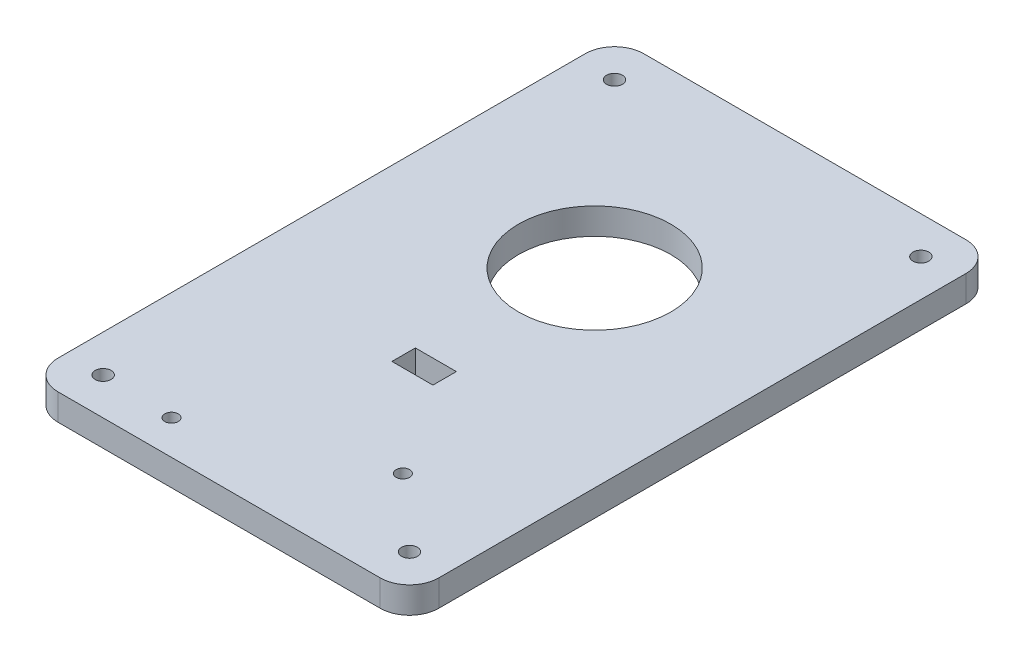
ISO-10303-21;
HEADER;
FILE_DESCRIPTION(('STEP AP214'),'2;1');
FILE_NAME('part.step','',(''),(''),'','','');
FILE_SCHEMA(('AUTOMOTIVE_DESIGN { 1 0 10303 214 1 1 1 1 }'));
ENDSEC;
DATA;
#1=APPLICATION_CONTEXT('core data for automotive mechanical design processes');
#2=APPLICATION_PROTOCOL_DEFINITION('international standard','automotive_design',2000,#1);
#3=PRODUCT_CONTEXT('',#1,'mechanical');
#4=PRODUCT('Part','Part','',(#3));
#5=PRODUCT_RELATED_PRODUCT_CATEGORY('part','',(#4));
#6=PRODUCT_DEFINITION_FORMATION('','',#4);
#7=PRODUCT_DEFINITION_CONTEXT('part definition',#1,'design');
#8=PRODUCT_DEFINITION('design','',#6,#7);
#9=PRODUCT_DEFINITION_SHAPE('','',#8);
#10=(LENGTH_UNIT() NAMED_UNIT(*) SI_UNIT(.MILLI.,.METRE.));
#11=(NAMED_UNIT(*) PLANE_ANGLE_UNIT() SI_UNIT($,.RADIAN.));
#12=(NAMED_UNIT(*) SI_UNIT($,.STERADIAN.) SOLID_ANGLE_UNIT());
#13=UNCERTAINTY_MEASURE_WITH_UNIT(LENGTH_MEASURE(1.E-05),#10,'distance_accuracy_value','');
#14=(GEOMETRIC_REPRESENTATION_CONTEXT(3) GLOBAL_UNCERTAINTY_ASSIGNED_CONTEXT((#13)) GLOBAL_UNIT_ASSIGNED_CONTEXT((#10,
#11,#12)) REPRESENTATION_CONTEXT('',''));
#15=CARTESIAN_POINT('',(0.,0.,0.));
#16=DIRECTION('',(0.,0.,1.));
#17=DIRECTION('',(1.,0.,0.));
#18=AXIS2_PLACEMENT_3D('',#15,#16,#17);
#19=CARTESIAN_POINT('',(32.5,4.5,-50.));
#20=DIRECTION('',(-1.,0.,0.));
#21=DIRECTION('',(0.,0.,1.));
#22=AXIS2_PLACEMENT_3D('',#19,#20,#21);
#23=PLANE('',#22);
#24=DIRECTION('',(0.,0.,-1.));
#25=VECTOR('',#24,1.);
#26=CARTESIAN_POINT('',(32.5,0.,-50.));
#27=LINE('',#26,#25);
#28=CARTESIAN_POINT('',(32.5,0.,45.));
#29=VERTEX_POINT('',#28);
#30=CARTESIAN_POINT('',(32.5,0.,-45.));
#31=VERTEX_POINT('',#30);
#32=EDGE_CURVE('E192',#29,#31,#27,.T.);
#33=ORIENTED_EDGE('',*,*,#32,.T.);
#34=DIRECTION('',(0.,-1.,0.));
#35=VECTOR('',#34,1.);
#36=CARTESIAN_POINT('',(32.5,4.5,-45.));
#37=LINE('',#36,#35);
#38=CARTESIAN_POINT('',(32.5,4.5,-45.));
#39=VERTEX_POINT('',#38);
#40=EDGE_CURVE('E245',#31,#39,#37,.F.);
#41=ORIENTED_EDGE('',*,*,#40,.T.);
#42=DIRECTION('',(0.,0.,-1.));
#43=VECTOR('',#42,1.);
#44=CARTESIAN_POINT('',(32.5,4.5,-50.));
#45=LINE('',#44,#43);
#46=CARTESIAN_POINT('',(32.5,4.5,45.));
#47=VERTEX_POINT('',#46);
#48=EDGE_CURVE('E193',#47,#39,#45,.T.);
#49=ORIENTED_EDGE('',*,*,#48,.F.);
#50=DIRECTION('',(0.,-1.,0.));
#51=VECTOR('',#50,1.);
#52=CARTESIAN_POINT('',(32.5,4.5,45.));
#53=LINE('',#52,#51);
#54=EDGE_CURVE('E242',#47,#29,#53,.T.);
#55=ORIENTED_EDGE('',*,*,#54,.T.);
#56=EDGE_LOOP('',(#33,#41,#49,#55));
#57=FACE_BOUND('',#56,.T.);
#58=ADVANCED_FACE('F38',(#57),#23,.F.);
#59=CARTESIAN_POINT('',(-32.5,4.5,-50.));
#60=DIRECTION('',(0.,0.,1.));
#61=DIRECTION('',(1.,0.,0.));
#62=AXIS2_PLACEMENT_3D('',#59,#60,#61);
#63=PLANE('',#62);
#64=DIRECTION('',(-1.,0.,0.));
#65=VECTOR('',#64,1.);
#66=CARTESIAN_POINT('',(-32.5,0.,-50.));
#67=LINE('',#66,#65);
#68=CARTESIAN_POINT('',(27.5,0.,-50.));
#69=VERTEX_POINT('',#68);
#70=CARTESIAN_POINT('',(-27.5,0.,-50.));
#71=VERTEX_POINT('',#70);
#72=EDGE_CURVE('E209',#69,#71,#67,.T.);
#73=ORIENTED_EDGE('',*,*,#72,.T.);
#74=DIRECTION('',(0.,-1.,0.));
#75=VECTOR('',#74,1.);
#76=CARTESIAN_POINT('',(-27.5,4.5,-50.));
#77=LINE('',#76,#75);
#78=CARTESIAN_POINT('',(-27.5,4.5,-50.));
#79=VERTEX_POINT('',#78);
#80=EDGE_CURVE('E232',#71,#79,#77,.F.);
#81=ORIENTED_EDGE('',*,*,#80,.T.);
#82=DIRECTION('',(-1.,0.,0.));
#83=VECTOR('',#82,1.);
#84=CARTESIAN_POINT('',(-32.5,4.5,-50.));
#85=LINE('',#84,#83);
#86=CARTESIAN_POINT('',(27.5,4.5,-50.));
#87=VERTEX_POINT('',#86);
#88=EDGE_CURVE('E196',#87,#79,#85,.T.);
#89=ORIENTED_EDGE('',*,*,#88,.F.);
#90=DIRECTION('',(0.,-1.,0.));
#91=VECTOR('',#90,1.);
#92=CARTESIAN_POINT('',(27.5,4.5,-50.));
#93=LINE('',#92,#91);
#94=EDGE_CURVE('E229',#87,#69,#93,.T.);
#95=ORIENTED_EDGE('',*,*,#94,.T.);
#96=EDGE_LOOP('',(#73,#81,#89,#95));
#97=FACE_BOUND('',#96,.T.);
#98=ADVANCED_FACE('F276',(#97),#63,.F.);
#99=CARTESIAN_POINT('',(-32.5,4.5,-50.));
#100=DIRECTION('',(1.,0.,0.));
#101=DIRECTION('',(0.,0.,-1.));
#102=AXIS2_PLACEMENT_3D('',#99,#100,#101);
#103=PLANE('',#102);
#104=DIRECTION('',(0.,0.,1.));
#105=VECTOR('',#104,1.);
#106=CARTESIAN_POINT('',(-32.5,4.5,-50.));
#107=LINE('',#106,#105);
#108=CARTESIAN_POINT('',(-32.5,4.5,-45.));
#109=VERTEX_POINT('',#108);
#110=CARTESIAN_POINT('',(-32.5,4.5,45.));
#111=VERTEX_POINT('',#110);
#112=EDGE_CURVE('E200',#109,#111,#107,.T.);
#113=ORIENTED_EDGE('',*,*,#112,.F.);
#114=DIRECTION('',(0.,-1.,0.));
#115=VECTOR('',#114,1.);
#116=CARTESIAN_POINT('',(-32.5,4.5,-45.));
#117=LINE('',#116,#115);
#118=CARTESIAN_POINT('',(-32.5,0.,-45.));
#119=VERTEX_POINT('',#118);
#120=EDGE_CURVE('E218',#109,#119,#117,.T.);
#121=ORIENTED_EDGE('',*,*,#120,.T.);
#122=DIRECTION('',(0.,0.,1.));
#123=VECTOR('',#122,1.);
#124=CARTESIAN_POINT('',(-32.5,0.,-50.));
#125=LINE('',#124,#123);
#126=CARTESIAN_POINT('',(-32.5,0.,45.));
#127=VERTEX_POINT('',#126);
#128=EDGE_CURVE('E212',#119,#127,#125,.T.);
#129=ORIENTED_EDGE('',*,*,#128,.T.);
#130=DIRECTION('',(0.,-1.,0.));
#131=VECTOR('',#130,1.);
#132=CARTESIAN_POINT('',(-32.5,4.5,45.));
#133=LINE('',#132,#131);
#134=EDGE_CURVE('E206',#127,#111,#133,.F.);
#135=ORIENTED_EDGE('',*,*,#134,.T.);
#136=EDGE_LOOP('',(#113,#121,#129,#135));
#137=FACE_BOUND('',#136,.T.);
#138=ADVANCED_FACE('F282',(#137),#103,.F.);
#139=CARTESIAN_POINT('',(-32.5,4.5,50.));
#140=DIRECTION('',(0.,0.,-1.));
#141=DIRECTION('',(-1.,0.,0.));
#142=AXIS2_PLACEMENT_3D('',#139,#140,#141);
#143=PLANE('',#142);
#144=DIRECTION('',(1.,0.,0.));
#145=VECTOR('',#144,1.);
#146=CARTESIAN_POINT('',(-32.5,0.,50.));
#147=LINE('',#146,#145);
#148=CARTESIAN_POINT('',(-27.5,0.,50.));
#149=VERTEX_POINT('',#148);
#150=CARTESIAN_POINT('',(27.5,0.,50.));
#151=VERTEX_POINT('',#150);
#152=EDGE_CURVE('E197',#149,#151,#147,.T.);
#153=ORIENTED_EDGE('',*,*,#152,.T.);
#154=DIRECTION('',(0.,-1.,0.));
#155=VECTOR('',#154,1.);
#156=CARTESIAN_POINT('',(27.5,4.5,50.));
#157=LINE('',#156,#155);
#158=CARTESIAN_POINT('',(27.5,4.5,50.));
#159=VERTEX_POINT('',#158);
#160=EDGE_CURVE('E250',#151,#159,#157,.F.);
#161=ORIENTED_EDGE('',*,*,#160,.T.);
#162=DIRECTION('',(1.,0.,0.));
#163=VECTOR('',#162,1.);
#164=CARTESIAN_POINT('',(-32.5,4.5,50.));
#165=LINE('',#164,#163);
#166=CARTESIAN_POINT('',(-27.5,4.5,50.));
#167=VERTEX_POINT('',#166);
#168=EDGE_CURVE('E203',#167,#159,#165,.T.);
#169=ORIENTED_EDGE('',*,*,#168,.F.);
#170=DIRECTION('',(0.,-1.,0.));
#171=VECTOR('',#170,1.);
#172=CARTESIAN_POINT('',(-27.5,4.5,50.));
#173=LINE('',#172,#171);
#174=EDGE_CURVE('E247',#167,#149,#173,.T.);
#175=ORIENTED_EDGE('',*,*,#174,.T.);
#176=EDGE_LOOP('',(#153,#161,#169,#175));
#177=FACE_BOUND('',#176,.T.);
#178=ADVANCED_FACE('F324',(#177),#143,.F.);
#179=CARTESIAN_POINT('',(0.,4.5,0.));
#180=DIRECTION('',(0.,1.,0.));
#181=DIRECTION('',(0.,0.,1.));
#182=AXIS2_PLACEMENT_3D('',#179,#180,#181);
#183=PLANE('',#182);
#184=CARTESIAN_POINT('',(0.,4.5,-14.1153706470118));
#185=DIRECTION('',(0.,1.,0.));
#186=DIRECTION('',(0.,0.,1.));
#187=AXIS2_PLACEMENT_3D('',#184,#185,#186);
#188=CIRCLE('',#187,13.);
#189=CARTESIAN_POINT('',(0.,4.5,-1.11537064701181));
#190=VERTEX_POINT('',#189);
#191=EDGE_CURVE('E518',#190,#190,#188,.T.);
#192=ORIENTED_EDGE('',*,*,#191,.F.);
#193=EDGE_LOOP('',(#192));
#194=FACE_BOUND('',#193,.T.);
#195=DIRECTION('',(0.,0.,-1.));
#196=VECTOR('',#195,1.);
#197=CARTESIAN_POINT('',(3.5,4.5,13.));
#198=LINE('',#197,#196);
#199=CARTESIAN_POINT('',(3.5,4.5,17.));
#200=VERTEX_POINT('',#199);
#201=CARTESIAN_POINT('',(3.5,4.5,13.));
#202=VERTEX_POINT('',#201);
#203=EDGE_CURVE('E54',#200,#202,#198,.T.);
#204=ORIENTED_EDGE('',*,*,#203,.F.);
#205=DIRECTION('',(1.,0.,0.));
#206=VECTOR('',#205,1.);
#207=CARTESIAN_POINT('',(-3.5,4.5,17.));
#208=LINE('',#207,#206);
#209=CARTESIAN_POINT('',(-3.5,4.5,17.));
#210=VERTEX_POINT('',#209);
#211=EDGE_CURVE('E147',#210,#200,#208,.T.);
#212=ORIENTED_EDGE('',*,*,#211,.F.);
#213=DIRECTION('',(0.,0.,1.));
#214=VECTOR('',#213,1.);
#215=CARTESIAN_POINT('',(-3.5,4.5,13.));
#216=LINE('',#215,#214);
#217=CARTESIAN_POINT('',(-3.5,4.5,13.));
#218=VERTEX_POINT('',#217);
#219=EDGE_CURVE('E131',#218,#210,#216,.T.);
#220=ORIENTED_EDGE('',*,*,#219,.F.);
#221=DIRECTION('',(-1.,0.,0.));
#222=VECTOR('',#221,1.);
#223=CARTESIAN_POINT('',(-3.5,4.5,13.));
#224=LINE('',#223,#222);
#225=EDGE_CURVE('E140',#202,#218,#224,.T.);
#226=ORIENTED_EDGE('',*,*,#225,.F.);
#227=EDGE_LOOP('',(#204,#212,#220,#226));
#228=FACE_BOUND('',#227,.T.);
#229=CARTESIAN_POINT('',(14.,4.5,32.6313813250558));
#230=DIRECTION('',(0.,1.,0.));
#231=DIRECTION('',(0.,0.,1.));
#232=AXIS2_PLACEMENT_3D('',#229,#230,#231);
#233=CIRCLE('',#232,1.15);
#234=CARTESIAN_POINT('',(14.,4.5,33.7813813250558));
#235=VERTEX_POINT('',#234);
#236=EDGE_CURVE('E154',#235,#235,#233,.T.);
#237=ORIENTED_EDGE('',*,*,#236,.F.);
#238=EDGE_LOOP('',(#237));
#239=FACE_BOUND('',#238,.T.);
#240=CARTESIAN_POINT('',(-14.,4.5,44.1313813250558));
#241=DIRECTION('',(0.,1.,0.));
#242=DIRECTION('',(0.,0.,1.));
#243=AXIS2_PLACEMENT_3D('',#240,#241,#242);
#244=CIRCLE('',#243,1.15);
#245=CARTESIAN_POINT('',(-14.,4.5,45.2813813250558));
#246=VERTEX_POINT('',#245);
#247=EDGE_CURVE('E162',#246,#246,#244,.T.);
#248=ORIENTED_EDGE('',*,*,#247,.F.);
#249=EDGE_LOOP('',(#248));
#250=FACE_BOUND('',#249,.T.);
#251=CARTESIAN_POINT('',(-26.15,4.5,-43.65));
#252=DIRECTION('',(0.,1.,0.));
#253=DIRECTION('',(0.,0.,1.));
#254=AXIS2_PLACEMENT_3D('',#251,#252,#253);
#255=CIRCLE('',#254,1.35255);
#256=CARTESIAN_POINT('',(-26.15,4.5,-42.29745));
#257=VERTEX_POINT('',#256);
#258=EDGE_CURVE('E168',#257,#257,#255,.T.);
#259=ORIENTED_EDGE('',*,*,#258,.F.);
#260=EDGE_LOOP('',(#259));
#261=FACE_BOUND('',#260,.T.);
#262=CARTESIAN_POINT('',(26.15,4.5,-43.65));
#263=DIRECTION('',(0.,1.,0.));
#264=DIRECTION('',(0.,0.,1.));
#265=AXIS2_PLACEMENT_3D('',#262,#263,#264);
#266=CIRCLE('',#265,1.35255);
#267=CARTESIAN_POINT('',(26.15,4.5,-42.29745));
#268=VERTEX_POINT('',#267);
#269=EDGE_CURVE('E174',#268,#268,#266,.T.);
#270=ORIENTED_EDGE('',*,*,#269,.F.);
#271=EDGE_LOOP('',(#270));
#272=FACE_BOUND('',#271,.T.);
#273=CARTESIAN_POINT('',(26.15,4.5,43.65));
#274=DIRECTION('',(0.,1.,0.));
#275=DIRECTION('',(0.,0.,1.));
#276=AXIS2_PLACEMENT_3D('',#273,#274,#275);
#277=CIRCLE('',#276,1.35255);
#278=CARTESIAN_POINT('',(26.15,4.5,45.00255));
#279=VERTEX_POINT('',#278);
#280=EDGE_CURVE('E180',#279,#279,#277,.T.);
#281=ORIENTED_EDGE('',*,*,#280,.F.);
#282=EDGE_LOOP('',(#281));
#283=FACE_BOUND('',#282,.T.);
#284=CARTESIAN_POINT('',(-26.15,4.5,43.65));
#285=DIRECTION('',(0.,1.,0.));
#286=DIRECTION('',(0.,0.,1.));
#287=AXIS2_PLACEMENT_3D('',#284,#285,#286);
#288=CIRCLE('',#287,1.35255);
#289=CARTESIAN_POINT('',(-26.15,4.5,45.00255));
#290=VERTEX_POINT('',#289);
#291=EDGE_CURVE('E186',#290,#290,#288,.T.);
#292=ORIENTED_EDGE('',*,*,#291,.F.);
#293=EDGE_LOOP('',(#292));
#294=FACE_BOUND('',#293,.T.);
#295=ORIENTED_EDGE('',*,*,#88,.T.);
#296=CARTESIAN_POINT('',(-27.5,4.5,-45.));
#297=DIRECTION('',(0.,1.,0.));
#298=DIRECTION('',(0.,0.,1.));
#299=AXIS2_PLACEMENT_3D('',#296,#297,#298);
#300=CIRCLE('',#299,5.);
#301=EDGE_CURVE('E240',#79,#109,#300,.T.);
#302=ORIENTED_EDGE('',*,*,#301,.T.);
#303=ORIENTED_EDGE('',*,*,#112,.T.);
#304=CARTESIAN_POINT('',(-27.5,4.5,45.));
#305=DIRECTION('',(0.,1.,0.));
#306=DIRECTION('',(0.,0.,1.));
#307=AXIS2_PLACEMENT_3D('',#304,#305,#306);
#308=CIRCLE('',#307,5.);
#309=EDGE_CURVE('E234',#111,#167,#308,.T.);
#310=ORIENTED_EDGE('',*,*,#309,.T.);
#311=ORIENTED_EDGE('',*,*,#168,.T.);
#312=CARTESIAN_POINT('',(27.5,4.5,45.));
#313=DIRECTION('',(0.,1.,0.));
#314=DIRECTION('',(0.,0.,1.));
#315=AXIS2_PLACEMENT_3D('',#312,#313,#314);
#316=CIRCLE('',#315,5.);
#317=EDGE_CURVE('E236',#159,#47,#316,.T.);
#318=ORIENTED_EDGE('',*,*,#317,.T.);
#319=ORIENTED_EDGE('',*,*,#48,.T.);
#320=CARTESIAN_POINT('',(27.5,4.5,-45.));
#321=DIRECTION('',(0.,1.,0.));
#322=DIRECTION('',(0.,0.,1.));
#323=AXIS2_PLACEMENT_3D('',#320,#321,#322);
#324=CIRCLE('',#323,5.);
#325=EDGE_CURVE('E238',#39,#87,#324,.T.);
#326=ORIENTED_EDGE('',*,*,#325,.T.);
#327=EDGE_LOOP('',(#295,#302,#303,#310,#311,#318,#319,#326));
#328=FACE_BOUND('',#327,.T.);
#329=ADVANCED_FACE('F144',(#194,#228,#239,#250,#261,#272,#283,#294,#328),#183,.T.);
#330=CARTESIAN_POINT('',(0.,0.,0.));
#331=DIRECTION('',(0.,1.,0.));
#332=DIRECTION('',(0.,0.,1.));
#333=AXIS2_PLACEMENT_3D('',#330,#331,#332);
#334=PLANE('',#333);
#335=CARTESIAN_POINT('',(0.,0.,-14.1153706470118));
#336=DIRECTION('',(0.,1.,0.));
#337=DIRECTION('',(0.,0.,1.));
#338=AXIS2_PLACEMENT_3D('',#335,#336,#337);
#339=CIRCLE('',#338,13.);
#340=CARTESIAN_POINT('',(0.,0.,-1.11537064701181));
#341=VERTEX_POINT('',#340);
#342=EDGE_CURVE('E42',#341,#341,#339,.T.);
#343=ORIENTED_EDGE('',*,*,#342,.T.);
#344=EDGE_LOOP('',(#343));
#345=FACE_BOUND('',#344,.T.);
#346=DIRECTION('',(1.,0.,0.));
#347=VECTOR('',#346,1.);
#348=CARTESIAN_POINT('',(0.,0.,17.));
#349=LINE('',#348,#347);
#350=CARTESIAN_POINT('',(-3.5,0.,17.));
#351=VERTEX_POINT('',#350);
#352=CARTESIAN_POINT('',(3.5,0.,17.));
#353=VERTEX_POINT('',#352);
#354=EDGE_CURVE('E47',#351,#353,#349,.T.);
#355=ORIENTED_EDGE('',*,*,#354,.T.);
#356=DIRECTION('',(0.,0.,-1.));
#357=VECTOR('',#356,1.);
#358=CARTESIAN_POINT('',(3.5,0.,0.));
#359=LINE('',#358,#357);
#360=CARTESIAN_POINT('',(3.5,0.,13.));
#361=VERTEX_POINT('',#360);
#362=EDGE_CURVE('E11',#353,#361,#359,.T.);
#363=ORIENTED_EDGE('',*,*,#362,.T.);
#364=DIRECTION('',(-1.,0.,0.));
#365=VECTOR('',#364,1.);
#366=CARTESIAN_POINT('',(0.,0.,13.));
#367=LINE('',#366,#365);
#368=CARTESIAN_POINT('',(-3.5,0.,13.));
#369=VERTEX_POINT('',#368);
#370=EDGE_CURVE('E252',#361,#369,#367,.T.);
#371=ORIENTED_EDGE('',*,*,#370,.T.);
#372=DIRECTION('',(0.,0.,1.));
#373=VECTOR('',#372,1.);
#374=CARTESIAN_POINT('',(-3.5,0.,0.));
#375=LINE('',#374,#373);
#376=EDGE_CURVE('E134',#369,#351,#375,.T.);
#377=ORIENTED_EDGE('',*,*,#376,.T.);
#378=EDGE_LOOP('',(#355,#363,#371,#377));
#379=FACE_BOUND('',#378,.T.);
#380=CARTESIAN_POINT('',(14.,0.,32.6313813250558));
#381=DIRECTION('',(0.,1.,0.));
#382=DIRECTION('',(0.,0.,1.));
#383=AXIS2_PLACEMENT_3D('',#380,#381,#382);
#384=CIRCLE('',#383,1.15);
#385=CARTESIAN_POINT('',(14.,0.,33.7813813250558));
#386=VERTEX_POINT('',#385);
#387=EDGE_CURVE('E159',#386,#386,#384,.T.);
#388=ORIENTED_EDGE('',*,*,#387,.T.);
#389=EDGE_LOOP('',(#388));
#390=FACE_BOUND('',#389,.T.);
#391=CARTESIAN_POINT('',(-14.,0.,44.1313813250558));
#392=DIRECTION('',(0.,1.,0.));
#393=DIRECTION('',(0.,0.,1.));
#394=AXIS2_PLACEMENT_3D('',#391,#392,#393);
#395=CIRCLE('',#394,1.15);
#396=CARTESIAN_POINT('',(-14.,0.,45.2813813250558));
#397=VERTEX_POINT('',#396);
#398=EDGE_CURVE('E165',#397,#397,#395,.T.);
#399=ORIENTED_EDGE('',*,*,#398,.T.);
#400=EDGE_LOOP('',(#399));
#401=FACE_BOUND('',#400,.T.);
#402=CARTESIAN_POINT('',(-26.15,0.,-43.65));
#403=DIRECTION('',(0.,1.,0.));
#404=DIRECTION('',(0.,0.,1.));
#405=AXIS2_PLACEMENT_3D('',#402,#403,#404);
#406=CIRCLE('',#405,1.35255);
#407=CARTESIAN_POINT('',(-26.15,0.,-42.29745));
#408=VERTEX_POINT('',#407);
#409=EDGE_CURVE('E171',#408,#408,#406,.T.);
#410=ORIENTED_EDGE('',*,*,#409,.T.);
#411=EDGE_LOOP('',(#410));
#412=FACE_BOUND('',#411,.T.);
#413=CARTESIAN_POINT('',(26.15,0.,-43.65));
#414=DIRECTION('',(0.,1.,0.));
#415=DIRECTION('',(0.,0.,1.));
#416=AXIS2_PLACEMENT_3D('',#413,#414,#415);
#417=CIRCLE('',#416,1.35255);
#418=CARTESIAN_POINT('',(26.15,0.,-42.29745));
#419=VERTEX_POINT('',#418);
#420=EDGE_CURVE('E177',#419,#419,#417,.T.);
#421=ORIENTED_EDGE('',*,*,#420,.T.);
#422=EDGE_LOOP('',(#421));
#423=FACE_BOUND('',#422,.T.);
#424=CARTESIAN_POINT('',(26.15,0.,43.65));
#425=DIRECTION('',(0.,1.,0.));
#426=DIRECTION('',(0.,0.,1.));
#427=AXIS2_PLACEMENT_3D('',#424,#425,#426);
#428=CIRCLE('',#427,1.35255);
#429=CARTESIAN_POINT('',(26.15,0.,45.00255));
#430=VERTEX_POINT('',#429);
#431=EDGE_CURVE('E183',#430,#430,#428,.T.);
#432=ORIENTED_EDGE('',*,*,#431,.T.);
#433=EDGE_LOOP('',(#432));
#434=FACE_BOUND('',#433,.T.);
#435=CARTESIAN_POINT('',(-26.15,0.,43.65));
#436=DIRECTION('',(0.,1.,0.));
#437=DIRECTION('',(0.,0.,1.));
#438=AXIS2_PLACEMENT_3D('',#435,#436,#437);
#439=CIRCLE('',#438,1.35255);
#440=CARTESIAN_POINT('',(-26.15,0.,45.00255));
#441=VERTEX_POINT('',#440);
#442=EDGE_CURVE('E189',#441,#441,#439,.T.);
#443=ORIENTED_EDGE('',*,*,#442,.T.);
#444=EDGE_LOOP('',(#443));
#445=FACE_BOUND('',#444,.T.);
#446=ORIENTED_EDGE('',*,*,#128,.F.);
#447=CARTESIAN_POINT('',(-27.5,0.,-45.));
#448=DIRECTION('',(0.,1.,0.));
#449=DIRECTION('',(0.,0.,1.));
#450=AXIS2_PLACEMENT_3D('',#447,#448,#449);
#451=CIRCLE('',#450,5.);
#452=EDGE_CURVE('E227',#119,#71,#451,.F.);
#453=ORIENTED_EDGE('',*,*,#452,.T.);
#454=ORIENTED_EDGE('',*,*,#72,.F.);
#455=CARTESIAN_POINT('',(27.5,0.,-45.));
#456=DIRECTION('',(0.,1.,0.));
#457=DIRECTION('',(0.,0.,1.));
#458=AXIS2_PLACEMENT_3D('',#455,#456,#457);
#459=CIRCLE('',#458,5.);
#460=EDGE_CURVE('E225',#69,#31,#459,.F.);
#461=ORIENTED_EDGE('',*,*,#460,.T.);
#462=ORIENTED_EDGE('',*,*,#32,.F.);
#463=CARTESIAN_POINT('',(27.5,0.,45.));
#464=DIRECTION('',(0.,1.,0.));
#465=DIRECTION('',(0.,0.,1.));
#466=AXIS2_PLACEMENT_3D('',#463,#464,#465);
#467=CIRCLE('',#466,5.);
#468=EDGE_CURVE('E223',#29,#151,#467,.F.);
#469=ORIENTED_EDGE('',*,*,#468,.T.);
#470=ORIENTED_EDGE('',*,*,#152,.F.);
#471=CARTESIAN_POINT('',(-27.5,0.,45.));
#472=DIRECTION('',(0.,1.,0.));
#473=DIRECTION('',(0.,0.,1.));
#474=AXIS2_PLACEMENT_3D('',#471,#472,#473);
#475=CIRCLE('',#474,5.);
#476=EDGE_CURVE('E221',#149,#127,#475,.F.);
#477=ORIENTED_EDGE('',*,*,#476,.T.);
#478=EDGE_LOOP('',(#446,#453,#454,#461,#462,#469,#470,#477));
#479=FACE_BOUND('',#478,.T.);
#480=ADVANCED_FACE('F257',(#345,#379,#390,#401,#412,#423,#434,#445,#479),#334,.F.);
#481=CARTESIAN_POINT('',(-26.15,4.5,43.65));
#482=DIRECTION('',(0.,1.,0.));
#483=DIRECTION('',(0.,0.,1.));
#484=AXIS2_PLACEMENT_3D('',#481,#482,#483);
#485=CYLINDRICAL_SURFACE('',#484,1.35255);
#486=ORIENTED_EDGE('',*,*,#442,.F.);
#487=EDGE_LOOP('',(#486));
#488=FACE_BOUND('',#487,.T.);
#489=ORIENTED_EDGE('',*,*,#291,.T.);
#490=EDGE_LOOP('',(#489));
#491=FACE_BOUND('',#490,.T.);
#492=ADVANCED_FACE('F328',(#488,#491),#485,.F.);
#493=CARTESIAN_POINT('',(26.15,4.5,43.65));
#494=DIRECTION('',(0.,1.,0.));
#495=DIRECTION('',(0.,0.,1.));
#496=AXIS2_PLACEMENT_3D('',#493,#494,#495);
#497=CYLINDRICAL_SURFACE('',#496,1.35255);
#498=ORIENTED_EDGE('',*,*,#431,.F.);
#499=EDGE_LOOP('',(#498));
#500=FACE_BOUND('',#499,.T.);
#501=ORIENTED_EDGE('',*,*,#280,.T.);
#502=EDGE_LOOP('',(#501));
#503=FACE_BOUND('',#502,.T.);
#504=ADVANCED_FACE('F335',(#500,#503),#497,.F.);
#505=CARTESIAN_POINT('',(26.15,4.5,-43.65));
#506=DIRECTION('',(0.,1.,0.));
#507=DIRECTION('',(0.,0.,1.));
#508=AXIS2_PLACEMENT_3D('',#505,#506,#507);
#509=CYLINDRICAL_SURFACE('',#508,1.35255);
#510=ORIENTED_EDGE('',*,*,#420,.F.);
#511=EDGE_LOOP('',(#510));
#512=FACE_BOUND('',#511,.T.);
#513=ORIENTED_EDGE('',*,*,#269,.T.);
#514=EDGE_LOOP('',(#513));
#515=FACE_BOUND('',#514,.T.);
#516=ADVANCED_FACE('F438',(#512,#515),#509,.F.);
#517=CARTESIAN_POINT('',(-26.15,4.5,-43.65));
#518=DIRECTION('',(0.,1.,0.));
#519=DIRECTION('',(0.,0.,1.));
#520=AXIS2_PLACEMENT_3D('',#517,#518,#519);
#521=CYLINDRICAL_SURFACE('',#520,1.35255);
#522=ORIENTED_EDGE('',*,*,#409,.F.);
#523=EDGE_LOOP('',(#522));
#524=FACE_BOUND('',#523,.T.);
#525=ORIENTED_EDGE('',*,*,#258,.T.);
#526=EDGE_LOOP('',(#525));
#527=FACE_BOUND('',#526,.T.);
#528=ADVANCED_FACE('F291',(#524,#527),#521,.F.);
#529=CARTESIAN_POINT('',(-27.5,4.5,-45.));
#530=DIRECTION('',(0.,-1.,0.));
#531=DIRECTION('',(0.,0.,-1.));
#532=AXIS2_PLACEMENT_3D('',#529,#530,#531);
#533=CYLINDRICAL_SURFACE('',#532,5.);
#534=ORIENTED_EDGE('',*,*,#301,.F.);
#535=ORIENTED_EDGE('',*,*,#80,.F.);
#536=ORIENTED_EDGE('',*,*,#452,.F.);
#537=ORIENTED_EDGE('',*,*,#120,.F.);
#538=EDGE_LOOP('',(#534,#535,#536,#537));
#539=FACE_BOUND('',#538,.T.);
#540=ADVANCED_FACE('F287',(#539),#533,.T.);
#541=CARTESIAN_POINT('',(27.5,4.5,-45.));
#542=DIRECTION('',(0.,-1.,0.));
#543=DIRECTION('',(0.,0.,-1.));
#544=AXIS2_PLACEMENT_3D('',#541,#542,#543);
#545=CYLINDRICAL_SURFACE('',#544,5.);
#546=ORIENTED_EDGE('',*,*,#325,.F.);
#547=ORIENTED_EDGE('',*,*,#40,.F.);
#548=ORIENTED_EDGE('',*,*,#460,.F.);
#549=ORIENTED_EDGE('',*,*,#94,.F.);
#550=EDGE_LOOP('',(#546,#547,#548,#549));
#551=FACE_BOUND('',#550,.T.);
#552=ADVANCED_FACE('F290',(#551),#545,.T.);
#553=CARTESIAN_POINT('',(27.5,4.5,45.));
#554=DIRECTION('',(0.,-1.,0.));
#555=DIRECTION('',(0.,0.,-1.));
#556=AXIS2_PLACEMENT_3D('',#553,#554,#555);
#557=CYLINDRICAL_SURFACE('',#556,5.);
#558=ORIENTED_EDGE('',*,*,#317,.F.);
#559=ORIENTED_EDGE('',*,*,#160,.F.);
#560=ORIENTED_EDGE('',*,*,#468,.F.);
#561=ORIENTED_EDGE('',*,*,#54,.F.);
#562=EDGE_LOOP('',(#558,#559,#560,#561));
#563=FACE_BOUND('',#562,.T.);
#564=ADVANCED_FACE('F294',(#563),#557,.T.);
#565=CARTESIAN_POINT('',(-27.5,4.5,45.));
#566=DIRECTION('',(0.,-1.,0.));
#567=DIRECTION('',(0.,0.,-1.));
#568=AXIS2_PLACEMENT_3D('',#565,#566,#567);
#569=CYLINDRICAL_SURFACE('',#568,5.);
#570=ORIENTED_EDGE('',*,*,#309,.F.);
#571=ORIENTED_EDGE('',*,*,#134,.F.);
#572=ORIENTED_EDGE('',*,*,#476,.F.);
#573=ORIENTED_EDGE('',*,*,#174,.F.);
#574=EDGE_LOOP('',(#570,#571,#572,#573));
#575=FACE_BOUND('',#574,.T.);
#576=ADVANCED_FACE('F40',(#575),#569,.T.);
#577=CARTESIAN_POINT('',(-14.,4.5,44.1313813250558));
#578=DIRECTION('',(0.,1.,0.));
#579=DIRECTION('',(0.,0.,1.));
#580=AXIS2_PLACEMENT_3D('',#577,#578,#579);
#581=CYLINDRICAL_SURFACE('',#580,1.15);
#582=ORIENTED_EDGE('',*,*,#398,.F.);
#583=EDGE_LOOP('',(#582));
#584=FACE_BOUND('',#583,.T.);
#585=ORIENTED_EDGE('',*,*,#247,.T.);
#586=EDGE_LOOP('',(#585));
#587=FACE_BOUND('',#586,.T.);
#588=ADVANCED_FACE('F271',(#584,#587),#581,.F.);
#589=CARTESIAN_POINT('',(14.,4.5,32.6313813250558));
#590=DIRECTION('',(0.,1.,0.));
#591=DIRECTION('',(0.,0.,1.));
#592=AXIS2_PLACEMENT_3D('',#589,#590,#591);
#593=CYLINDRICAL_SURFACE('',#592,1.15);
#594=ORIENTED_EDGE('',*,*,#387,.F.);
#595=EDGE_LOOP('',(#594));
#596=FACE_BOUND('',#595,.T.);
#597=ORIENTED_EDGE('',*,*,#236,.T.);
#598=EDGE_LOOP('',(#597));
#599=FACE_BOUND('',#598,.T.);
#600=ADVANCED_FACE('F264',(#596,#599),#593,.F.);
#601=CARTESIAN_POINT('',(3.5,-5.5,13.));
#602=DIRECTION('',(1.,0.,0.));
#603=DIRECTION('',(0.,0.,-1.));
#604=AXIS2_PLACEMENT_3D('',#601,#602,#603);
#605=PLANE('',#604);
#606=DIRECTION('',(0.,1.,0.));
#607=VECTOR('',#606,1.);
#608=CARTESIAN_POINT('',(3.5,-5.5,17.));
#609=LINE('',#608,#607);
#610=EDGE_CURVE('E152',#353,#200,#609,.T.);
#611=ORIENTED_EDGE('',*,*,#610,.T.);
#612=ORIENTED_EDGE('',*,*,#203,.T.);
#613=DIRECTION('',(0.,1.,0.));
#614=VECTOR('',#613,1.);
#615=CARTESIAN_POINT('',(3.5,-5.5,13.));
#616=LINE('',#615,#614);
#617=EDGE_CURVE('E137',#361,#202,#616,.T.);
#618=ORIENTED_EDGE('',*,*,#617,.F.);
#619=ORIENTED_EDGE('',*,*,#362,.F.);
#620=EDGE_LOOP('',(#611,#612,#618,#619));
#621=FACE_BOUND('',#620,.T.);
#622=ADVANCED_FACE('F262',(#621),#605,.F.);
#623=CARTESIAN_POINT('',(-3.5,-5.5,17.));
#624=DIRECTION('',(0.,0.,1.));
#625=DIRECTION('',(1.,0.,0.));
#626=AXIS2_PLACEMENT_3D('',#623,#624,#625);
#627=PLANE('',#626);
#628=DIRECTION('',(0.,1.,0.));
#629=VECTOR('',#628,1.);
#630=CARTESIAN_POINT('',(-3.5,-5.5,17.));
#631=LINE('',#630,#629);
#632=EDGE_CURVE('E136',#351,#210,#631,.T.);
#633=ORIENTED_EDGE('',*,*,#632,.T.);
#634=ORIENTED_EDGE('',*,*,#211,.T.);
#635=ORIENTED_EDGE('',*,*,#610,.F.);
#636=ORIENTED_EDGE('',*,*,#354,.F.);
#637=EDGE_LOOP('',(#633,#634,#635,#636));
#638=FACE_BOUND('',#637,.T.);
#639=ADVANCED_FACE('F261',(#638),#627,.F.);
#640=CARTESIAN_POINT('',(-3.5,-5.5,13.));
#641=DIRECTION('',(-1.,0.,0.));
#642=DIRECTION('',(0.,0.,1.));
#643=AXIS2_PLACEMENT_3D('',#640,#641,#642);
#644=PLANE('',#643);
#645=DIRECTION('',(0.,1.,0.));
#646=VECTOR('',#645,1.);
#647=CARTESIAN_POINT('',(-3.5,-5.5,13.));
#648=LINE('',#647,#646);
#649=EDGE_CURVE('E62',#369,#218,#648,.T.);
#650=ORIENTED_EDGE('',*,*,#649,.T.);
#651=ORIENTED_EDGE('',*,*,#219,.T.);
#652=ORIENTED_EDGE('',*,*,#632,.F.);
#653=ORIENTED_EDGE('',*,*,#376,.F.);
#654=EDGE_LOOP('',(#650,#651,#652,#653));
#655=FACE_BOUND('',#654,.T.);
#656=ADVANCED_FACE('F128',(#655),#644,.F.);
#657=CARTESIAN_POINT('',(-3.5,-5.5,13.));
#658=DIRECTION('',(0.,0.,-1.));
#659=DIRECTION('',(-1.,0.,0.));
#660=AXIS2_PLACEMENT_3D('',#657,#658,#659);
#661=PLANE('',#660);
#662=ORIENTED_EDGE('',*,*,#617,.T.);
#663=ORIENTED_EDGE('',*,*,#225,.T.);
#664=ORIENTED_EDGE('',*,*,#649,.F.);
#665=ORIENTED_EDGE('',*,*,#370,.F.);
#666=EDGE_LOOP('',(#662,#663,#664,#665));
#667=FACE_BOUND('',#666,.T.);
#668=ADVANCED_FACE('F141',(#667),#661,.F.);
#669=CARTESIAN_POINT('',(0.,-12.5,-14.1153706470118));
#670=DIRECTION('',(0.,1.,0.));
#671=DIRECTION('',(0.,0.,1.));
#672=AXIS2_PLACEMENT_3D('',#669,#670,#671);
#673=CYLINDRICAL_SURFACE('',#672,13.);
#674=ORIENTED_EDGE('',*,*,#191,.T.);
#675=EDGE_LOOP('',(#674));
#676=FACE_BOUND('',#675,.T.);
#677=ORIENTED_EDGE('',*,*,#342,.F.);
#678=EDGE_LOOP('',(#677));
#679=FACE_BOUND('',#678,.T.);
#680=ADVANCED_FACE('F372',(#676,#679),#673,.F.);
#681=CLOSED_SHELL('',(#58,#98,#138,#178,#329,#480,#492,#504,#516,#528,#540,#552,#564,#576,#588,
#600,#622,#639,#656,#668,#680));
#682=MANIFOLD_SOLID_BREP('B2',#681);
#683=ADVANCED_BREP_SHAPE_REPRESENTATION('',(#18,#682),#14);
#684=SHAPE_DEFINITION_REPRESENTATION(#9,#683);
ENDSEC;
END-ISO-10303-21;
